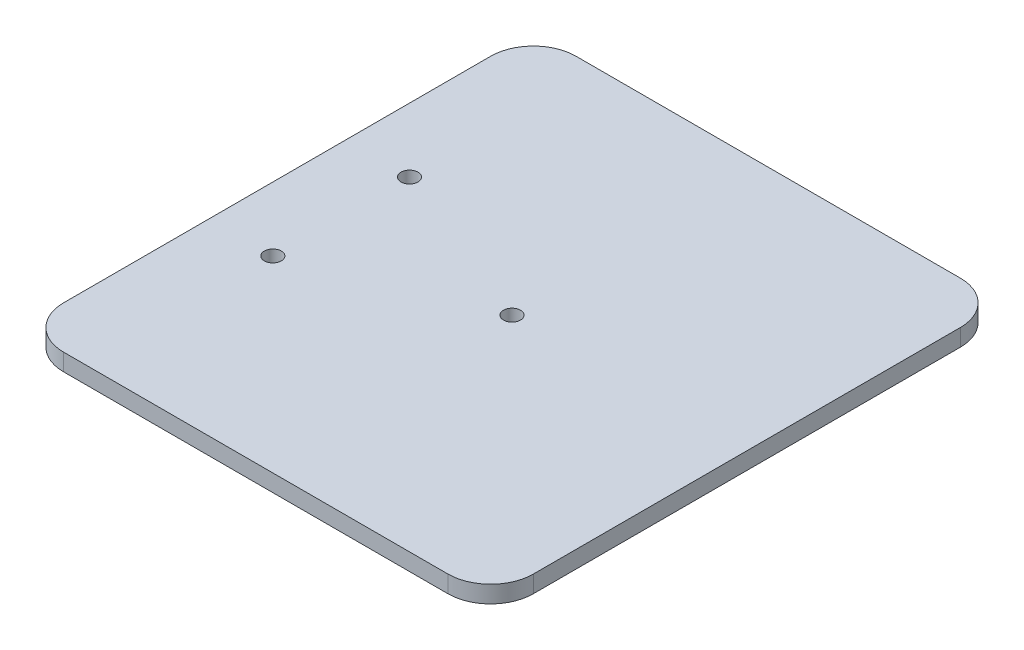
ISO-10303-21;
HEADER;
FILE_DESCRIPTION(('STEP AP214'),'2;1');
FILE_NAME('part.step','',(''),(''),'','','');
FILE_SCHEMA(('AUTOMOTIVE_DESIGN { 1 0 10303 214 1 1 1 1 }'));
ENDSEC;
DATA;
#1=APPLICATION_CONTEXT('core data for automotive mechanical design processes');
#2=APPLICATION_PROTOCOL_DEFINITION('international standard','automotive_design',2000,#1);
#3=PRODUCT_CONTEXT('',#1,'mechanical');
#4=PRODUCT('Part','Part','',(#3));
#5=PRODUCT_RELATED_PRODUCT_CATEGORY('part','',(#4));
#6=PRODUCT_DEFINITION_FORMATION('','',#4);
#7=PRODUCT_DEFINITION_CONTEXT('part definition',#1,'design');
#8=PRODUCT_DEFINITION('design','',#6,#7);
#9=PRODUCT_DEFINITION_SHAPE('','',#8);
#10=(LENGTH_UNIT() NAMED_UNIT(*) SI_UNIT(.MILLI.,.METRE.));
#11=(NAMED_UNIT(*) PLANE_ANGLE_UNIT() SI_UNIT($,.RADIAN.));
#12=(NAMED_UNIT(*) SI_UNIT($,.STERADIAN.) SOLID_ANGLE_UNIT());
#13=UNCERTAINTY_MEASURE_WITH_UNIT(LENGTH_MEASURE(1.E-05),#10,'distance_accuracy_value','');
#14=(GEOMETRIC_REPRESENTATION_CONTEXT(3) GLOBAL_UNCERTAINTY_ASSIGNED_CONTEXT((#13)) GLOBAL_UNIT_ASSIGNED_CONTEXT((#10,
#11,#12)) REPRESENTATION_CONTEXT('',''));
#15=CARTESIAN_POINT('',(0.,0.,0.));
#16=DIRECTION('',(0.,0.,1.));
#17=DIRECTION('',(1.,0.,0.));
#18=AXIS2_PLACEMENT_3D('',#15,#16,#17);
#19=CARTESIAN_POINT('',(8.19905213270141,2.,25.1421800947867));
#20=DIRECTION('',(0.,1.,0.));
#21=DIRECTION('',(0.,0.,1.));
#22=AXIS2_PLACEMENT_3D('',#19,#20,#21);
#23=PLANE('',#22);
#24=CARTESIAN_POINT('',(-34.3009478672986,2.,8.14218009478673));
#25=DIRECTION('',(0.,1.,0.));
#26=DIRECTION('',(0.,0.,1.));
#27=AXIS2_PLACEMENT_3D('',#24,#25,#26);
#28=CIRCLE('',#27,0.999999999999998);
#29=CARTESIAN_POINT('',(-34.3009478672986,2.,9.14218009478673));
#30=VERTEX_POINT('',#29);
#31=EDGE_CURVE('E217',#30,#30,#28,.T.);
#32=ORIENTED_EDGE('',*,*,#31,.F.);
#33=EDGE_LOOP('',(#32));
#34=FACE_BOUND('',#33,.T.);
#35=CARTESIAN_POINT('',(8.19905213270141,2.,25.1421800947867));
#36=DIRECTION('',(0.,1.,0.));
#37=DIRECTION('',(0.,0.,1.));
#38=AXIS2_PLACEMENT_3D('',#35,#36,#37);
#39=CIRCLE('',#38,5.);
#40=CARTESIAN_POINT('',(8.19905213270137,2.,30.1421800947867));
#41=VERTEX_POINT('',#40);
#42=CARTESIAN_POINT('',(13.1990521327014,2.,25.1421800947867));
#43=VERTEX_POINT('',#42);
#44=EDGE_CURVE('E168',#41,#43,#39,.T.);
#45=ORIENTED_EDGE('',*,*,#44,.T.);
#46=DIRECTION('',(0.,0.,-1.));
#47=VECTOR('',#46,1.);
#48=CARTESIAN_POINT('',(13.1990521327014,2.,-24.8578199052132));
#49=LINE('',#48,#47);
#50=CARTESIAN_POINT('',(13.1990521327014,2.,-24.8578199052132));
#51=VERTEX_POINT('',#50);
#52=EDGE_CURVE('E104',#43,#51,#49,.T.);
#53=ORIENTED_EDGE('',*,*,#52,.T.);
#54=CARTESIAN_POINT('',(8.19905213270141,2.,-24.8578199052133));
#55=DIRECTION('',(0.,1.,0.));
#56=DIRECTION('',(0.,0.,-1.));
#57=AXIS2_PLACEMENT_3D('',#54,#55,#56);
#58=CIRCLE('',#57,5.);
#59=CARTESIAN_POINT('',(8.19905213270137,2.,-29.8578199052133));
#60=VERTEX_POINT('',#59);
#61=EDGE_CURVE('E189',#51,#60,#58,.T.);
#62=ORIENTED_EDGE('',*,*,#61,.T.);
#63=DIRECTION('',(-1.,0.,0.));
#64=VECTOR('',#63,1.);
#65=CARTESIAN_POINT('',(-36.8009478672986,2.,-29.8578199052133));
#66=LINE('',#65,#64);
#67=CARTESIAN_POINT('',(-36.8009478672986,2.,-29.8578199052133));
#68=VERTEX_POINT('',#67);
#69=EDGE_CURVE('E203',#60,#68,#66,.T.);
#70=ORIENTED_EDGE('',*,*,#69,.T.);
#71=CARTESIAN_POINT('',(-36.8009478672986,2.,-24.8578199052133));
#72=DIRECTION('',(0.,1.,0.));
#73=DIRECTION('',(0.,0.,-1.));
#74=AXIS2_PLACEMENT_3D('',#71,#72,#73);
#75=CIRCLE('',#74,5.);
#76=CARTESIAN_POINT('',(-41.8009478672986,2.,-24.8578199052132));
#77=VERTEX_POINT('',#76);
#78=EDGE_CURVE('E123',#68,#77,#75,.T.);
#79=ORIENTED_EDGE('',*,*,#78,.T.);
#80=DIRECTION('',(0.,0.,1.));
#81=VECTOR('',#80,1.);
#82=CARTESIAN_POINT('',(-41.8009478672986,2.,-24.8578199052132));
#83=LINE('',#82,#81);
#84=CARTESIAN_POINT('',(-41.8009478672986,2.,25.1421800947867));
#85=VERTEX_POINT('',#84);
#86=EDGE_CURVE('E117',#77,#85,#83,.T.);
#87=ORIENTED_EDGE('',*,*,#86,.T.);
#88=CARTESIAN_POINT('',(-36.8009478672986,2.,25.1421800947867));
#89=DIRECTION('',(0.,1.,0.));
#90=DIRECTION('',(0.,0.,1.));
#91=AXIS2_PLACEMENT_3D('',#88,#89,#90);
#92=CIRCLE('',#91,5.);
#93=CARTESIAN_POINT('',(-36.8009478672986,2.,30.1421800947867));
#94=VERTEX_POINT('',#93);
#95=EDGE_CURVE('E121',#85,#94,#92,.T.);
#96=ORIENTED_EDGE('',*,*,#95,.T.);
#97=DIRECTION('',(1.,0.,0.));
#98=VECTOR('',#97,1.);
#99=CARTESIAN_POINT('',(-36.8009478672986,2.,30.1421800947867));
#100=LINE('',#99,#98);
#101=EDGE_CURVE('E61',#94,#41,#100,.T.);
#102=ORIENTED_EDGE('',*,*,#101,.T.);
#103=EDGE_LOOP('',(#45,#53,#62,#70,#79,#87,#96,#102));
#104=FACE_BOUND('',#103,.T.);
#105=CARTESIAN_POINT('',(-34.3009478672986,2.,-7.85781990521327));
#106=DIRECTION('',(0.,1.,0.));
#107=DIRECTION('',(0.,0.,1.));
#108=AXIS2_PLACEMENT_3D('',#105,#106,#107);
#109=CIRCLE('',#108,0.999999999999998);
#110=CARTESIAN_POINT('',(-34.3009478672986,2.,-6.85781990521327));
#111=VERTEX_POINT('',#110);
#112=EDGE_CURVE('E150',#111,#111,#109,.T.);
#113=ORIENTED_EDGE('',*,*,#112,.F.);
#114=EDGE_LOOP('',(#113));
#115=FACE_BOUND('',#114,.T.);
#116=CARTESIAN_POINT('',(-14.3009478672986,2.,0.142180094786729));
#117=DIRECTION('',(0.,1.,0.));
#118=DIRECTION('',(0.,0.,1.));
#119=AXIS2_PLACEMENT_3D('',#116,#117,#118);
#120=CIRCLE('',#119,1.);
#121=CARTESIAN_POINT('',(-14.3009478672986,2.,1.14218009478673));
#122=VERTEX_POINT('',#121);
#123=EDGE_CURVE('E225',#122,#122,#120,.T.);
#124=ORIENTED_EDGE('',*,*,#123,.F.);
#125=EDGE_LOOP('',(#124));
#126=FACE_BOUND('',#125,.T.);
#127=ADVANCED_FACE('F43',(#34,#104,#115,#126),#23,.T.);
#128=CARTESIAN_POINT('',(8.19905213270141,0.,25.1421800947867));
#129=DIRECTION('',(0.,1.,0.));
#130=DIRECTION('',(0.,0.,1.));
#131=AXIS2_PLACEMENT_3D('',#128,#129,#130);
#132=PLANE('',#131);
#133=CARTESIAN_POINT('',(8.19905213270141,0.,25.1421800947867));
#134=DIRECTION('',(0.,1.,0.));
#135=DIRECTION('',(0.,0.,1.));
#136=AXIS2_PLACEMENT_3D('',#133,#134,#135);
#137=CIRCLE('',#136,5.);
#138=CARTESIAN_POINT('',(8.19905213270137,0.,30.1421800947867));
#139=VERTEX_POINT('',#138);
#140=CARTESIAN_POINT('',(13.1990521327014,0.,25.1421800947867));
#141=VERTEX_POINT('',#140);
#142=EDGE_CURVE('E145',#139,#141,#137,.T.);
#143=ORIENTED_EDGE('',*,*,#142,.F.);
#144=DIRECTION('',(1.,0.,0.));
#145=VECTOR('',#144,1.);
#146=CARTESIAN_POINT('',(-36.8009478672986,0.,30.1421800947867));
#147=LINE('',#146,#145);
#148=CARTESIAN_POINT('',(-36.8009478672986,0.,30.1421800947867));
#149=VERTEX_POINT('',#148);
#150=EDGE_CURVE('E96',#149,#139,#147,.T.);
#151=ORIENTED_EDGE('',*,*,#150,.F.);
#152=CARTESIAN_POINT('',(-36.8009478672986,0.,25.1421800947867));
#153=DIRECTION('',(0.,1.,0.));
#154=DIRECTION('',(0.,0.,1.));
#155=AXIS2_PLACEMENT_3D('',#152,#153,#154);
#156=CIRCLE('',#155,5.);
#157=CARTESIAN_POINT('',(-41.8009478672986,0.,25.1421800947867));
#158=VERTEX_POINT('',#157);
#159=EDGE_CURVE('E90',#158,#149,#156,.T.);
#160=ORIENTED_EDGE('',*,*,#159,.F.);
#161=DIRECTION('',(0.,0.,1.));
#162=VECTOR('',#161,1.);
#163=CARTESIAN_POINT('',(-41.8009478672986,0.,-24.8578199052132));
#164=LINE('',#163,#162);
#165=CARTESIAN_POINT('',(-41.8009478672986,0.,-24.8578199052132));
#166=VERTEX_POINT('',#165);
#167=EDGE_CURVE('E132',#166,#158,#164,.T.);
#168=ORIENTED_EDGE('',*,*,#167,.F.);
#169=CARTESIAN_POINT('',(-36.8009478672986,0.,-24.8578199052133));
#170=DIRECTION('',(0.,1.,0.));
#171=DIRECTION('',(0.,0.,-1.));
#172=AXIS2_PLACEMENT_3D('',#169,#170,#171);
#173=CIRCLE('',#172,5.);
#174=CARTESIAN_POINT('',(-36.8009478672986,0.,-29.8578199052133));
#175=VERTEX_POINT('',#174);
#176=EDGE_CURVE('E159',#175,#166,#173,.T.);
#177=ORIENTED_EDGE('',*,*,#176,.F.);
#178=DIRECTION('',(-1.,0.,0.));
#179=VECTOR('',#178,1.);
#180=CARTESIAN_POINT('',(-36.8009478672986,0.,-29.8578199052133));
#181=LINE('',#180,#179);
#182=CARTESIAN_POINT('',(8.19905213270137,0.,-29.8578199052133));
#183=VERTEX_POINT('',#182);
#184=EDGE_CURVE('E156',#183,#175,#181,.T.);
#185=ORIENTED_EDGE('',*,*,#184,.F.);
#186=CARTESIAN_POINT('',(8.19905213270141,0.,-24.8578199052133));
#187=DIRECTION('',(0.,1.,0.));
#188=DIRECTION('',(0.,0.,-1.));
#189=AXIS2_PLACEMENT_3D('',#186,#187,#188);
#190=CIRCLE('',#189,5.);
#191=CARTESIAN_POINT('',(13.1990521327014,0.,-24.8578199052132));
#192=VERTEX_POINT('',#191);
#193=EDGE_CURVE('E153',#192,#183,#190,.T.);
#194=ORIENTED_EDGE('',*,*,#193,.F.);
#195=DIRECTION('',(0.,0.,-1.));
#196=VECTOR('',#195,1.);
#197=CARTESIAN_POINT('',(13.1990521327014,0.,-24.8578199052132));
#198=LINE('',#197,#196);
#199=EDGE_CURVE('E149',#141,#192,#198,.T.);
#200=ORIENTED_EDGE('',*,*,#199,.F.);
#201=EDGE_LOOP('',(#143,#151,#160,#168,#177,#185,#194,#200));
#202=FACE_BOUND('',#201,.T.);
#203=CARTESIAN_POINT('',(-34.3009478672986,0.,-7.85781990521327));
#204=DIRECTION('',(0.,1.,0.));
#205=DIRECTION('',(0.,0.,1.));
#206=AXIS2_PLACEMENT_3D('',#203,#204,#205);
#207=CIRCLE('',#206,0.999999999999998);
#208=CARTESIAN_POINT('',(-34.3009478672986,0.,-6.85781990521327));
#209=VERTEX_POINT('',#208);
#210=EDGE_CURVE('E213',#209,#209,#207,.T.);
#211=ORIENTED_EDGE('',*,*,#210,.T.);
#212=EDGE_LOOP('',(#211));
#213=FACE_BOUND('',#212,.T.);
#214=CARTESIAN_POINT('',(-34.3009478672986,0.,8.14218009478673));
#215=DIRECTION('',(0.,1.,0.));
#216=DIRECTION('',(0.,0.,1.));
#217=AXIS2_PLACEMENT_3D('',#214,#215,#216);
#218=CIRCLE('',#217,0.999999999999998);
#219=CARTESIAN_POINT('',(-34.3009478672986,0.,9.14218009478673));
#220=VERTEX_POINT('',#219);
#221=EDGE_CURVE('E221',#220,#220,#218,.T.);
#222=ORIENTED_EDGE('',*,*,#221,.T.);
#223=EDGE_LOOP('',(#222));
#224=FACE_BOUND('',#223,.T.);
#225=CARTESIAN_POINT('',(-14.3009478672986,0.,0.142180094786729));
#226=DIRECTION('',(0.,1.,0.));
#227=DIRECTION('',(0.,0.,1.));
#228=AXIS2_PLACEMENT_3D('',#225,#226,#227);
#229=CIRCLE('',#228,1.);
#230=CARTESIAN_POINT('',(-14.3009478672986,0.,1.14218009478673));
#231=VERTEX_POINT('',#230);
#232=EDGE_CURVE('E229',#231,#231,#229,.T.);
#233=ORIENTED_EDGE('',*,*,#232,.T.);
#234=EDGE_LOOP('',(#233));
#235=FACE_BOUND('',#234,.T.);
#236=ADVANCED_FACE('F193',(#202,#213,#224,#235),#132,.F.);
#237=CARTESIAN_POINT('',(8.19905213270141,2.,25.1421800947867));
#238=DIRECTION('',(0.,-1.,0.));
#239=DIRECTION('',(0.,0.,-1.));
#240=AXIS2_PLACEMENT_3D('',#237,#238,#239);
#241=CYLINDRICAL_SURFACE('',#240,5.);
#242=ORIENTED_EDGE('',*,*,#142,.T.);
#243=DIRECTION('',(0.,-1.,0.));
#244=VECTOR('',#243,1.);
#245=CARTESIAN_POINT('',(13.1990521327014,2.,25.1421800947867));
#246=LINE('',#245,#244);
#247=EDGE_CURVE('E11',#43,#141,#246,.T.);
#248=ORIENTED_EDGE('',*,*,#247,.F.);
#249=ORIENTED_EDGE('',*,*,#44,.F.);
#250=DIRECTION('',(0.,-1.,0.));
#251=VECTOR('',#250,1.);
#252=CARTESIAN_POINT('',(8.19905213270137,2.,30.1421800947867));
#253=LINE('',#252,#251);
#254=EDGE_CURVE('E141',#41,#139,#253,.T.);
#255=ORIENTED_EDGE('',*,*,#254,.T.);
#256=EDGE_LOOP('',(#242,#248,#249,#255));
#257=FACE_BOUND('',#256,.T.);
#258=ADVANCED_FACE('F45',(#257),#241,.T.);
#259=CARTESIAN_POINT('',(13.1990521327014,2.,-24.8578199052132));
#260=DIRECTION('',(-1.,0.,0.));
#261=DIRECTION('',(0.,0.,1.));
#262=AXIS2_PLACEMENT_3D('',#259,#260,#261);
#263=PLANE('',#262);
#264=ORIENTED_EDGE('',*,*,#199,.T.);
#265=DIRECTION('',(0.,-1.,0.));
#266=VECTOR('',#265,1.);
#267=CARTESIAN_POINT('',(13.1990521327014,2.,-24.8578199052132));
#268=LINE('',#267,#266);
#269=EDGE_CURVE('E53',#51,#192,#268,.T.);
#270=ORIENTED_EDGE('',*,*,#269,.F.);
#271=ORIENTED_EDGE('',*,*,#52,.F.);
#272=ORIENTED_EDGE('',*,*,#247,.T.);
#273=EDGE_LOOP('',(#264,#270,#271,#272));
#274=FACE_BOUND('',#273,.T.);
#275=ADVANCED_FACE('F264',(#274),#263,.F.);
#276=CARTESIAN_POINT('',(8.19905213270141,2.,-24.8578199052133));
#277=DIRECTION('',(0.,-1.,0.));
#278=DIRECTION('',(0.,0.,-1.));
#279=AXIS2_PLACEMENT_3D('',#276,#277,#278);
#280=CYLINDRICAL_SURFACE('',#279,5.);
#281=ORIENTED_EDGE('',*,*,#193,.T.);
#282=DIRECTION('',(0.,-1.,0.));
#283=VECTOR('',#282,1.);
#284=CARTESIAN_POINT('',(8.19905213270137,2.,-29.8578199052133));
#285=LINE('',#284,#283);
#286=EDGE_CURVE('E179',#60,#183,#285,.T.);
#287=ORIENTED_EDGE('',*,*,#286,.F.);
#288=ORIENTED_EDGE('',*,*,#61,.F.);
#289=ORIENTED_EDGE('',*,*,#269,.T.);
#290=EDGE_LOOP('',(#281,#287,#288,#289));
#291=FACE_BOUND('',#290,.T.);
#292=ADVANCED_FACE('F187',(#291),#280,.T.);
#293=CARTESIAN_POINT('',(-36.8009478672986,2.,-29.8578199052133));
#294=DIRECTION('',(0.,0.,1.));
#295=DIRECTION('',(1.,0.,0.));
#296=AXIS2_PLACEMENT_3D('',#293,#294,#295);
#297=PLANE('',#296);
#298=ORIENTED_EDGE('',*,*,#184,.T.);
#299=DIRECTION('',(0.,-1.,0.));
#300=VECTOR('',#299,1.);
#301=CARTESIAN_POINT('',(-36.8009478672986,2.,-29.8578199052133));
#302=LINE('',#301,#300);
#303=EDGE_CURVE('E175',#68,#175,#302,.T.);
#304=ORIENTED_EDGE('',*,*,#303,.F.);
#305=ORIENTED_EDGE('',*,*,#69,.F.);
#306=ORIENTED_EDGE('',*,*,#286,.T.);
#307=EDGE_LOOP('',(#298,#304,#305,#306));
#308=FACE_BOUND('',#307,.T.);
#309=ADVANCED_FACE('F198',(#308),#297,.F.);
#310=CARTESIAN_POINT('',(-36.8009478672986,2.,-24.8578199052133));
#311=DIRECTION('',(0.,-1.,0.));
#312=DIRECTION('',(0.,0.,-1.));
#313=AXIS2_PLACEMENT_3D('',#310,#311,#312);
#314=CYLINDRICAL_SURFACE('',#313,5.);
#315=ORIENTED_EDGE('',*,*,#176,.T.);
#316=DIRECTION('',(0.,-1.,0.));
#317=VECTOR('',#316,1.);
#318=CARTESIAN_POINT('',(-41.8009478672986,2.,-24.8578199052132));
#319=LINE('',#318,#317);
#320=EDGE_CURVE('E134',#77,#166,#319,.T.);
#321=ORIENTED_EDGE('',*,*,#320,.F.);
#322=ORIENTED_EDGE('',*,*,#78,.F.);
#323=ORIENTED_EDGE('',*,*,#303,.T.);
#324=EDGE_LOOP('',(#315,#321,#322,#323));
#325=FACE_BOUND('',#324,.T.);
#326=ADVANCED_FACE('F201',(#325),#314,.T.);
#327=CARTESIAN_POINT('',(-41.8009478672986,2.,-24.8578199052132));
#328=DIRECTION('',(1.,0.,0.));
#329=DIRECTION('',(0.,0.,-1.));
#330=AXIS2_PLACEMENT_3D('',#327,#328,#329);
#331=PLANE('',#330);
#332=ORIENTED_EDGE('',*,*,#167,.T.);
#333=DIRECTION('',(0.,-1.,0.));
#334=VECTOR('',#333,1.);
#335=CARTESIAN_POINT('',(-41.8009478672986,2.,25.1421800947867));
#336=LINE('',#335,#334);
#337=EDGE_CURVE('E129',#85,#158,#336,.T.);
#338=ORIENTED_EDGE('',*,*,#337,.F.);
#339=ORIENTED_EDGE('',*,*,#86,.F.);
#340=ORIENTED_EDGE('',*,*,#320,.T.);
#341=EDGE_LOOP('',(#332,#338,#339,#340));
#342=FACE_BOUND('',#341,.T.);
#343=ADVANCED_FACE('F130',(#342),#331,.F.);
#344=CARTESIAN_POINT('',(-36.8009478672986,2.,25.1421800947867));
#345=DIRECTION('',(0.,-1.,0.));
#346=DIRECTION('',(0.,0.,-1.));
#347=AXIS2_PLACEMENT_3D('',#344,#345,#346);
#348=CYLINDRICAL_SURFACE('',#347,5.);
#349=ORIENTED_EDGE('',*,*,#159,.T.);
#350=DIRECTION('',(0.,-1.,0.));
#351=VECTOR('',#350,1.);
#352=CARTESIAN_POINT('',(-36.8009478672986,2.,30.1421800947867));
#353=LINE('',#352,#351);
#354=EDGE_CURVE('E135',#94,#149,#353,.T.);
#355=ORIENTED_EDGE('',*,*,#354,.F.);
#356=ORIENTED_EDGE('',*,*,#95,.F.);
#357=ORIENTED_EDGE('',*,*,#337,.T.);
#358=EDGE_LOOP('',(#349,#355,#356,#357));
#359=FACE_BOUND('',#358,.T.);
#360=ADVANCED_FACE('F137',(#359),#348,.T.);
#361=CARTESIAN_POINT('',(-36.8009478672986,2.,30.1421800947867));
#362=DIRECTION('',(0.,0.,-1.));
#363=DIRECTION('',(-1.,0.,0.));
#364=AXIS2_PLACEMENT_3D('',#361,#362,#363);
#365=PLANE('',#364);
#366=ORIENTED_EDGE('',*,*,#150,.T.);
#367=ORIENTED_EDGE('',*,*,#254,.F.);
#368=ORIENTED_EDGE('',*,*,#101,.F.);
#369=ORIENTED_EDGE('',*,*,#354,.T.);
#370=EDGE_LOOP('',(#366,#367,#368,#369));
#371=FACE_BOUND('',#370,.T.);
#372=ADVANCED_FACE('F252',(#371),#365,.F.);
#373=CARTESIAN_POINT('',(-34.3009478672986,2.,-7.85781990521327));
#374=DIRECTION('',(0.,-1.,0.));
#375=DIRECTION('',(0.,0.,-1.));
#376=AXIS2_PLACEMENT_3D('',#373,#374,#375);
#377=CYLINDRICAL_SURFACE('',#376,0.999999999999998);
#378=ORIENTED_EDGE('',*,*,#112,.T.);
#379=EDGE_LOOP('',(#378));
#380=FACE_BOUND('',#379,.T.);
#381=ORIENTED_EDGE('',*,*,#210,.F.);
#382=EDGE_LOOP('',(#381));
#383=FACE_BOUND('',#382,.T.);
#384=ADVANCED_FACE('F249',(#380,#383),#377,.F.);
#385=CARTESIAN_POINT('',(-34.3009478672986,2.,8.14218009478673));
#386=DIRECTION('',(0.,-1.,0.));
#387=DIRECTION('',(0.,0.,-1.));
#388=AXIS2_PLACEMENT_3D('',#385,#386,#387);
#389=CYLINDRICAL_SURFACE('',#388,0.999999999999998);
#390=ORIENTED_EDGE('',*,*,#31,.T.);
#391=EDGE_LOOP('',(#390));
#392=FACE_BOUND('',#391,.T.);
#393=ORIENTED_EDGE('',*,*,#221,.F.);
#394=EDGE_LOOP('',(#393));
#395=FACE_BOUND('',#394,.T.);
#396=ADVANCED_FACE('F340',(#392,#395),#389,.F.);
#397=CARTESIAN_POINT('',(-14.3009478672986,2.,0.142180094786729));
#398=DIRECTION('',(0.,-1.,0.));
#399=DIRECTION('',(0.,0.,-1.));
#400=AXIS2_PLACEMENT_3D('',#397,#398,#399);
#401=CYLINDRICAL_SURFACE('',#400,1.);
#402=ORIENTED_EDGE('',*,*,#123,.T.);
#403=EDGE_LOOP('',(#402));
#404=FACE_BOUND('',#403,.T.);
#405=ORIENTED_EDGE('',*,*,#232,.F.);
#406=EDGE_LOOP('',(#405));
#407=FACE_BOUND('',#406,.T.);
#408=ADVANCED_FACE('F237',(#404,#407),#401,.F.);
#409=CLOSED_SHELL('',(#127,#236,#258,#275,#292,#309,#326,#343,#360,#372,#384,#396,#408));
#410=MANIFOLD_SOLID_BREP('B2',#409);
#411=ADVANCED_BREP_SHAPE_REPRESENTATION('',(#18,#410),#14);
#412=SHAPE_DEFINITION_REPRESENTATION(#9,#411);
ENDSEC;
END-ISO-10303-21;
